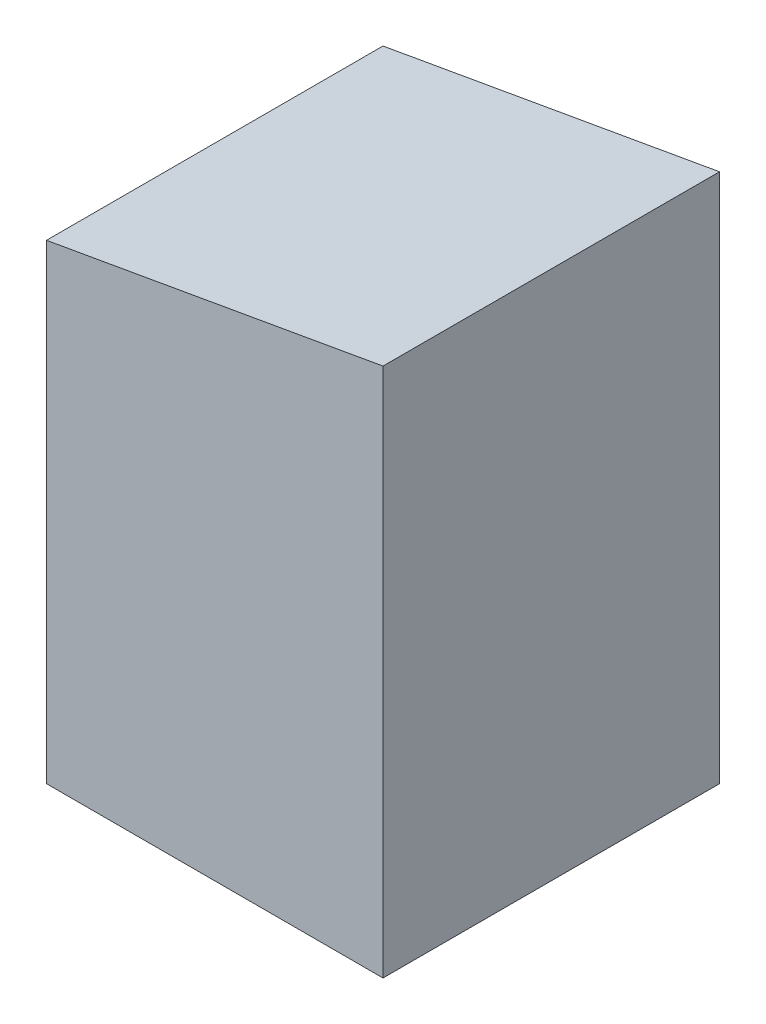
ISO-10303-21;
HEADER;
FILE_DESCRIPTION(('STEP AP214'),'2;1');
FILE_NAME('part.step','',(''),(''),'','','');
FILE_SCHEMA(('AUTOMOTIVE_DESIGN { 1 0 10303 214 1 1 1 1 }'));
ENDSEC;
DATA;
#1=APPLICATION_CONTEXT('core data for automotive mechanical design processes');
#2=APPLICATION_PROTOCOL_DEFINITION('international standard','automotive_design',2000,#1);
#3=PRODUCT_CONTEXT('',#1,'mechanical');
#4=PRODUCT('Part','Part','',(#3));
#5=PRODUCT_RELATED_PRODUCT_CATEGORY('part','',(#4));
#6=PRODUCT_DEFINITION_FORMATION('','',#4);
#7=PRODUCT_DEFINITION_CONTEXT('part definition',#1,'design');
#8=PRODUCT_DEFINITION('design','',#6,#7);
#9=PRODUCT_DEFINITION_SHAPE('','',#8);
#10=(LENGTH_UNIT() NAMED_UNIT(*) SI_UNIT(.MILLI.,.METRE.));
#11=(NAMED_UNIT(*) PLANE_ANGLE_UNIT() SI_UNIT($,.RADIAN.));
#12=(NAMED_UNIT(*) SI_UNIT($,.STERADIAN.) SOLID_ANGLE_UNIT());
#13=UNCERTAINTY_MEASURE_WITH_UNIT(LENGTH_MEASURE(1.E-05),#10,'distance_accuracy_value','');
#14=(GEOMETRIC_REPRESENTATION_CONTEXT(3) GLOBAL_UNCERTAINTY_ASSIGNED_CONTEXT((#13)) GLOBAL_UNIT_ASSIGNED_CONTEXT((#10,
#11,#12)) REPRESENTATION_CONTEXT('',''));
#15=CARTESIAN_POINT('',(0.,0.,0.));
#16=DIRECTION('',(0.,0.,1.));
#17=DIRECTION('',(1.,0.,0.));
#18=AXIS2_PLACEMENT_3D('',#15,#16,#17);
#19=CARTESIAN_POINT('',(44.45,140.,44.45));
#20=DIRECTION('',(-1.,0.,0.));
#21=DIRECTION('',(0.,0.,1.));
#22=AXIS2_PLACEMENT_3D('',#19,#20,#21);
#23=PLANE('',#22);
#24=DIRECTION('',(0.,0.,-1.));
#25=VECTOR('',#24,1.);
#26=CARTESIAN_POINT('',(44.45,0.,44.45));
#27=LINE('',#26,#25);
#28=CARTESIAN_POINT('',(44.45,0.,44.45));
#29=VERTEX_POINT('',#28);
#30=CARTESIAN_POINT('',(44.45,0.,-44.45));
#31=VERTEX_POINT('',#30);
#32=EDGE_CURVE('E107',#29,#31,#27,.T.);
#33=ORIENTED_EDGE('',*,*,#32,.T.);
#34=DIRECTION('',(0.,-1.,0.));
#35=VECTOR('',#34,1.);
#36=CARTESIAN_POINT('',(44.45,140.,-44.45));
#37=LINE('',#36,#35);
#38=CARTESIAN_POINT('',(44.45,140.,-44.45));
#39=VERTEX_POINT('',#38);
#40=EDGE_CURVE('E11',#39,#31,#37,.T.);
#41=ORIENTED_EDGE('',*,*,#40,.F.);
#42=DIRECTION('',(0.,0.,-1.));
#43=VECTOR('',#42,1.);
#44=CARTESIAN_POINT('',(44.45,140.,44.45));
#45=LINE('',#44,#43);
#46=CARTESIAN_POINT('',(44.45,140.,44.45));
#47=VERTEX_POINT('',#46);
#48=EDGE_CURVE('E109',#47,#39,#45,.T.);
#49=ORIENTED_EDGE('',*,*,#48,.F.);
#50=DIRECTION('',(0.,-1.,0.));
#51=VECTOR('',#50,1.);
#52=CARTESIAN_POINT('',(44.45,140.,44.45));
#53=LINE('',#52,#51);
#54=EDGE_CURVE('E93',#47,#29,#53,.T.);
#55=ORIENTED_EDGE('',*,*,#54,.T.);
#56=EDGE_LOOP('',(#33,#41,#49,#55));
#57=FACE_BOUND('',#56,.T.);
#58=ADVANCED_FACE('F51',(#57),#23,.F.);
#59=CARTESIAN_POINT('',(-44.45,140.,-44.45));
#60=DIRECTION('',(0.,0.,1.));
#61=DIRECTION('',(1.,0.,0.));
#62=AXIS2_PLACEMENT_3D('',#59,#60,#61);
#63=PLANE('',#62);
#64=DIRECTION('',(0.,-1.,0.));
#65=VECTOR('',#64,1.);
#66=CARTESIAN_POINT('',(-44.45,140.,-44.45));
#67=LINE('',#66,#65);
#68=CARTESIAN_POINT('',(-44.45,124.324531415018,-44.45));
#69=VERTEX_POINT('',#68);
#70=CARTESIAN_POINT('',(-44.45,0.,-44.45));
#71=VERTEX_POINT('',#70);
#72=EDGE_CURVE('E60',#69,#71,#67,.T.);
#73=ORIENTED_EDGE('',*,*,#72,.F.);
#74=DIRECTION('',(0.984807753012209,0.173648177666924,0.));
#75=VECTOR('',#74,1.);
#76=CARTESIAN_POINT('',(-41.7693369939338,124.797204629175,-44.45));
#77=LINE('',#76,#75);
#78=EDGE_CURVE('E124',#69,#39,#77,.T.);
#79=ORIENTED_EDGE('',*,*,#78,.T.);
#80=ORIENTED_EDGE('',*,*,#40,.T.);
#81=DIRECTION('',(-1.,0.,0.));
#82=VECTOR('',#81,1.);
#83=CARTESIAN_POINT('',(-44.45,0.,-44.45));
#84=LINE('',#83,#82);
#85=EDGE_CURVE('E102',#31,#71,#84,.T.);
#86=ORIENTED_EDGE('',*,*,#85,.T.);
#87=EDGE_LOOP('',(#73,#79,#80,#86));
#88=FACE_BOUND('',#87,.T.);
#89=ADVANCED_FACE('F126',(#88),#63,.F.);
#90=CARTESIAN_POINT('',(-44.45,140.,44.45));
#91=DIRECTION('',(1.,0.,0.));
#92=DIRECTION('',(0.,0.,-1.));
#93=AXIS2_PLACEMENT_3D('',#90,#91,#92);
#94=PLANE('',#93);
#95=DIRECTION('',(0.,-1.,0.));
#96=VECTOR('',#95,1.);
#97=CARTESIAN_POINT('',(-44.45,140.,44.45));
#98=LINE('',#97,#96);
#99=CARTESIAN_POINT('',(-44.45,124.324531415018,44.45));
#100=VERTEX_POINT('',#99);
#101=CARTESIAN_POINT('',(-44.45,0.,44.45));
#102=VERTEX_POINT('',#101);
#103=EDGE_CURVE('E83',#100,#102,#98,.T.);
#104=ORIENTED_EDGE('',*,*,#103,.F.);
#105=DIRECTION('',(0.,0.,1.));
#106=VECTOR('',#105,1.);
#107=CARTESIAN_POINT('',(-44.45,124.324531415018,-90.55));
#108=LINE('',#107,#106);
#109=EDGE_CURVE('E128',#69,#100,#108,.T.);
#110=ORIENTED_EDGE('',*,*,#109,.F.);
#111=ORIENTED_EDGE('',*,*,#72,.T.);
#112=DIRECTION('',(0.,0.,1.));
#113=VECTOR('',#112,1.);
#114=CARTESIAN_POINT('',(-44.45,0.,44.45));
#115=LINE('',#114,#113);
#116=EDGE_CURVE('E96',#71,#102,#115,.T.);
#117=ORIENTED_EDGE('',*,*,#116,.T.);
#118=EDGE_LOOP('',(#104,#110,#111,#117));
#119=FACE_BOUND('',#118,.T.);
#120=ADVANCED_FACE('F97',(#119),#94,.F.);
#121=CARTESIAN_POINT('',(-44.45,140.,44.45));
#122=DIRECTION('',(0.,0.,-1.));
#123=DIRECTION('',(-1.,0.,0.));
#124=AXIS2_PLACEMENT_3D('',#121,#122,#123);
#125=PLANE('',#124);
#126=ORIENTED_EDGE('',*,*,#54,.F.);
#127=DIRECTION('',(0.984807753012209,0.173648177666924,0.));
#128=VECTOR('',#127,1.);
#129=CARTESIAN_POINT('',(44.45,140.,44.45));
#130=LINE('',#129,#128);
#131=EDGE_CURVE('E67',#100,#47,#130,.T.);
#132=ORIENTED_EDGE('',*,*,#131,.F.);
#133=ORIENTED_EDGE('',*,*,#103,.T.);
#134=DIRECTION('',(1.,0.,0.));
#135=VECTOR('',#134,1.);
#136=CARTESIAN_POINT('',(-44.45,0.,44.45));
#137=LINE('',#136,#135);
#138=EDGE_CURVE('E87',#102,#29,#137,.T.);
#139=ORIENTED_EDGE('',*,*,#138,.T.);
#140=EDGE_LOOP('',(#126,#132,#133,#139));
#141=FACE_BOUND('',#140,.T.);
#142=ADVANCED_FACE('F85',(#141),#125,.F.);
#143=CARTESIAN_POINT('',(0.,0.,0.));
#144=DIRECTION('',(0.,-1.,0.));
#145=DIRECTION('',(0.,0.,-1.));
#146=AXIS2_PLACEMENT_3D('',#143,#144,#145);
#147=PLANE('',#146);
#148=ORIENTED_EDGE('',*,*,#32,.F.);
#149=ORIENTED_EDGE('',*,*,#138,.F.);
#150=ORIENTED_EDGE('',*,*,#116,.F.);
#151=ORIENTED_EDGE('',*,*,#85,.F.);
#152=EDGE_LOOP('',(#148,#149,#150,#151));
#153=FACE_BOUND('',#152,.T.);
#154=ADVANCED_FACE('F105',(#153),#147,.T.);
#155=CARTESIAN_POINT('',(44.45,140.,-90.55));
#156=DIRECTION('',(0.173648177666924,-0.984807753012209,0.));
#157=DIRECTION('',(0.984807753012209,0.173648177666924,0.));
#158=AXIS2_PLACEMENT_3D('',#155,#156,#157);
#159=PLANE('',#158);
#160=ORIENTED_EDGE('',*,*,#109,.T.);
#161=ORIENTED_EDGE('',*,*,#131,.T.);
#162=ORIENTED_EDGE('',*,*,#48,.T.);
#163=ORIENTED_EDGE('',*,*,#78,.F.);
#164=EDGE_LOOP('',(#160,#161,#162,#163));
#165=FACE_BOUND('',#164,.T.);
#166=ADVANCED_FACE('F122',(#165),#159,.F.);
#167=CLOSED_SHELL('',(#58,#89,#120,#142,#154,#166));
#168=MANIFOLD_SOLID_BREP('B2',#167);
#169=ADVANCED_BREP_SHAPE_REPRESENTATION('',(#18,#168),#14);
#170=SHAPE_DEFINITION_REPRESENTATION(#9,#169);
ENDSEC;
END-ISO-10303-21;
